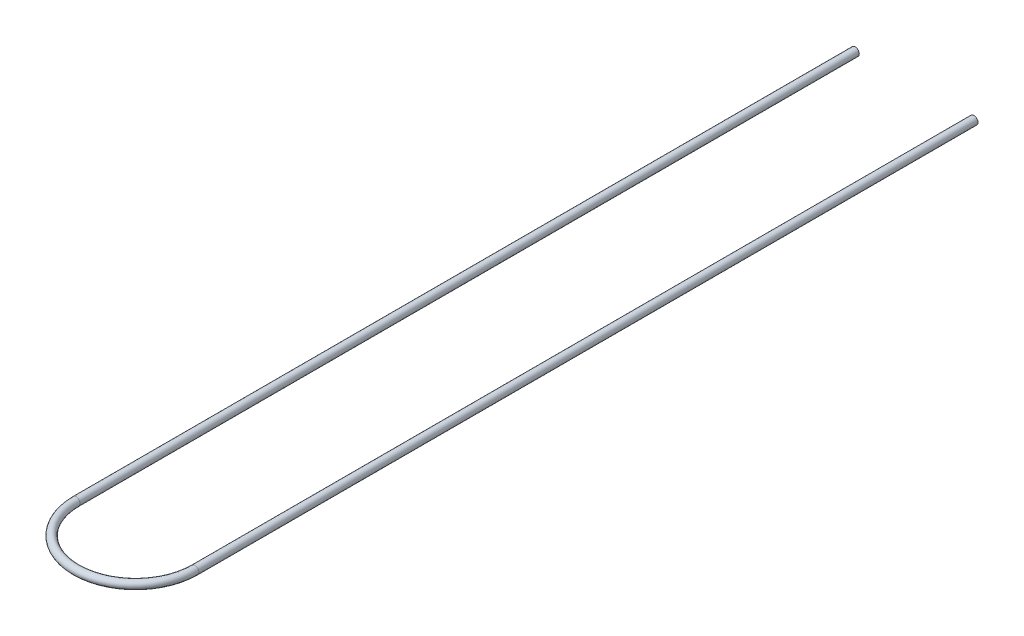
ISO-10303-21;
HEADER;
FILE_DESCRIPTION(('STEP AP214'),'2;1');
FILE_NAME('part.step','',(''),(''),'','','');
FILE_SCHEMA(('AUTOMOTIVE_DESIGN { 1 0 10303 214 1 1 1 1 }'));
ENDSEC;
DATA;
#1=APPLICATION_CONTEXT('core data for automotive mechanical design processes');
#2=APPLICATION_PROTOCOL_DEFINITION('international standard','automotive_design',2000,#1);
#3=PRODUCT_CONTEXT('',#1,'mechanical');
#4=PRODUCT('Part','Part','',(#3));
#5=PRODUCT_RELATED_PRODUCT_CATEGORY('part','',(#4));
#6=PRODUCT_DEFINITION_FORMATION('','',#4);
#7=PRODUCT_DEFINITION_CONTEXT('part definition',#1,'design');
#8=PRODUCT_DEFINITION('design','',#6,#7);
#9=PRODUCT_DEFINITION_SHAPE('','',#8);
#10=(LENGTH_UNIT() NAMED_UNIT(*) SI_UNIT(.MILLI.,.METRE.));
#11=(NAMED_UNIT(*) PLANE_ANGLE_UNIT() SI_UNIT($,.RADIAN.));
#12=(NAMED_UNIT(*) SI_UNIT($,.STERADIAN.) SOLID_ANGLE_UNIT());
#13=UNCERTAINTY_MEASURE_WITH_UNIT(LENGTH_MEASURE(1.E-05),#10,'distance_accuracy_value','');
#14=(GEOMETRIC_REPRESENTATION_CONTEXT(3) GLOBAL_UNCERTAINTY_ASSIGNED_CONTEXT((#13)) GLOBAL_UNIT_ASSIGNED_CONTEXT((#10,
#11,#12)) REPRESENTATION_CONTEXT('',''));
#15=CARTESIAN_POINT('',(0.,0.,0.));
#16=DIRECTION('',(0.,0.,1.));
#17=DIRECTION('',(1.,0.,0.));
#18=AXIS2_PLACEMENT_3D('',#15,#16,#17);
#19=CARTESIAN_POINT('',(-40.,0.,299.999999999999));
#20=DIRECTION('',(0.,0.,1.));
#21=DIRECTION('',(1.,0.,0.));
#22=AXIS2_PLACEMENT_3D('',#19,#20,#21);
#23=CYLINDRICAL_SURFACE('',#22,11.1);
#24=CARTESIAN_POINT('',(-39.9999999999997,0.,2440.));
#25=DIRECTION('',(0.,0.,1.));
#26=DIRECTION('',(1.,0.,0.));
#27=AXIS2_PLACEMENT_3D('',#24,#25,#26);
#28=CIRCLE('',#27,11.1);
#29=CARTESIAN_POINT('',(-51.0999999999997,0.,2440.));
#30=VERTEX_POINT('',#29);
#31=EDGE_CURVE('E52',#30,#30,#28,.T.);
#32=ORIENTED_EDGE('',*,*,#31,.F.);
#33=EDGE_LOOP('',(#32));
#34=FACE_BOUND('',#33,.T.);
#35=CARTESIAN_POINT('',(-40.,0.,299.999999999999));
#36=DIRECTION('',(0.,0.,1.));
#37=DIRECTION('',(1.,0.,0.));
#38=AXIS2_PLACEMENT_3D('',#35,#36,#37);
#39=CIRCLE('',#38,11.1);
#40=CARTESIAN_POINT('',(-28.9,0.,299.999999999999));
#41=VERTEX_POINT('',#40);
#42=EDGE_CURVE('E50',#41,#41,#39,.T.);
#43=ORIENTED_EDGE('',*,*,#42,.T.);
#44=EDGE_LOOP('',(#43));
#45=FACE_BOUND('',#44,.T.);
#46=ADVANCED_FACE('F29',(#34,#45),#23,.T.);
#47=CARTESIAN_POINT('',(123.08,0.,2440.));
#48=DIRECTION('',(0.,1.,0.));
#49=DIRECTION('',(0.,0.,1.));
#50=AXIS2_PLACEMENT_3D('',#47,#48,#49);
#51=TOROIDAL_SURFACE('',#50,163.08,11.1);
#52=CARTESIAN_POINT('',(286.16,0.,2440.));
#53=DIRECTION('',(0.,0.,-1.));
#54=DIRECTION('',(-1.,0.,0.));
#55=AXIS2_PLACEMENT_3D('',#52,#53,#54);
#56=CIRCLE('',#55,11.1);
#57=CARTESIAN_POINT('',(297.26,0.,2440.));
#58=VERTEX_POINT('',#57);
#59=EDGE_CURVE('E33',#58,#58,#56,.T.);
#60=CARTESIAN_POINT('',(123.08,0.,2440.));
#61=DIRECTION('',(0.,1.,0.));
#62=DIRECTION('',(0.,0.,1.));
#63=AXIS2_PLACEMENT_3D('',#60,#61,#62);
#64=CIRCLE('',#63,174.18);
#65=EDGE_CURVE('',#30,#58,#64,.T.);
#66=ORIENTED_EDGE('',*,*,#31,.T.);
#67=ORIENTED_EDGE('',*,*,#59,.F.);
#68=ORIENTED_EDGE('',*,*,#65,.T.);
#69=ORIENTED_EDGE('',*,*,#65,.F.);
#70=EDGE_LOOP('',(#66,#68,#67,#69));
#71=FACE_BOUND('',#70,.T.);
#72=ADVANCED_FACE('F60',(#71),#51,.T.);
#73=CARTESIAN_POINT('',(286.16,0.,2440.));
#74=DIRECTION('',(0.,0.,-1.));
#75=DIRECTION('',(-1.,0.,0.));
#76=AXIS2_PLACEMENT_3D('',#73,#74,#75);
#77=CYLINDRICAL_SURFACE('',#76,11.1);
#78=CARTESIAN_POINT('',(286.16,0.,299.999999999999));
#79=DIRECTION('',(0.,0.,-1.));
#80=DIRECTION('',(-1.,0.,0.));
#81=AXIS2_PLACEMENT_3D('',#78,#79,#80);
#82=CIRCLE('',#81,11.1);
#83=CARTESIAN_POINT('',(275.06,0.,299.999999999999));
#84=VERTEX_POINT('',#83);
#85=EDGE_CURVE('E46',#84,#84,#82,.T.);
#86=ORIENTED_EDGE('',*,*,#85,.F.);
#87=EDGE_LOOP('',(#86));
#88=FACE_BOUND('',#87,.T.);
#89=ORIENTED_EDGE('',*,*,#59,.T.);
#90=EDGE_LOOP('',(#89));
#91=FACE_BOUND('',#90,.T.);
#92=ADVANCED_FACE('F31',(#88,#91),#77,.T.);
#93=CARTESIAN_POINT('',(-40.,0.,299.999999999999));
#94=DIRECTION('',(0.,0.,1.));
#95=DIRECTION('',(1.,0.,0.));
#96=AXIS2_PLACEMENT_3D('',#93,#94,#95);
#97=PLANE('',#96);
#98=CARTESIAN_POINT('',(-40.,0.,299.999999999999));
#99=DIRECTION('',(0.,0.,1.));
#100=DIRECTION('',(1.,0.,0.));
#101=AXIS2_PLACEMENT_3D('',#98,#99,#100);
#102=CIRCLE('',#101,9.95000000000001);
#103=CARTESIAN_POINT('',(-30.05,0.,299.999999999999));
#104=VERTEX_POINT('',#103);
#105=EDGE_CURVE('E49',#104,#104,#102,.F.);
#106=ORIENTED_EDGE('',*,*,#105,.F.);
#107=EDGE_LOOP('',(#106));
#108=FACE_BOUND('',#107,.T.);
#109=ORIENTED_EDGE('',*,*,#42,.F.);
#110=EDGE_LOOP('',(#109));
#111=FACE_BOUND('',#110,.T.);
#112=ADVANCED_FACE('F66',(#108,#111),#97,.F.);
#113=CARTESIAN_POINT('',(286.16,0.,299.999999999999));
#114=DIRECTION('',(0.,0.,-1.));
#115=DIRECTION('',(-1.,0.,0.));
#116=AXIS2_PLACEMENT_3D('',#113,#114,#115);
#117=PLANE('',#116);
#118=CARTESIAN_POINT('',(286.16,0.,299.999999999999));
#119=DIRECTION('',(0.,0.,-1.));
#120=DIRECTION('',(-1.,0.,0.));
#121=AXIS2_PLACEMENT_3D('',#118,#119,#120);
#122=CIRCLE('',#121,9.95000000000001);
#123=CARTESIAN_POINT('',(276.21,0.,299.999999999999));
#124=VERTEX_POINT('',#123);
#125=EDGE_CURVE('E10',#124,#124,#122,.F.);
#126=ORIENTED_EDGE('',*,*,#125,.T.);
#127=EDGE_LOOP('',(#126));
#128=FACE_BOUND('',#127,.T.);
#129=ORIENTED_EDGE('',*,*,#85,.T.);
#130=EDGE_LOOP('',(#129));
#131=FACE_BOUND('',#130,.T.);
#132=ADVANCED_FACE('F84',(#128,#131),#117,.T.);
#133=CARTESIAN_POINT('',(-40.,0.,299.999999999999));
#134=DIRECTION('',(0.,0.,1.));
#135=DIRECTION('',(1.,0.,0.));
#136=AXIS2_PLACEMENT_3D('',#133,#134,#135);
#137=CYLINDRICAL_SURFACE('',#136,9.95000000000001);
#138=CARTESIAN_POINT('',(-39.9999999999997,0.,2440.));
#139=DIRECTION('',(0.,0.,1.));
#140=DIRECTION('',(1.,0.,0.));
#141=AXIS2_PLACEMENT_3D('',#138,#139,#140);
#142=CIRCLE('',#141,9.95000000000001);
#143=CARTESIAN_POINT('',(-49.9499999999997,0.,2440.));
#144=VERTEX_POINT('',#143);
#145=EDGE_CURVE('E42',#144,#144,#142,.F.);
#146=ORIENTED_EDGE('',*,*,#145,.F.);
#147=EDGE_LOOP('',(#146));
#148=FACE_BOUND('',#147,.T.);
#149=ORIENTED_EDGE('',*,*,#105,.T.);
#150=EDGE_LOOP('',(#149));
#151=FACE_BOUND('',#150,.T.);
#152=ADVANCED_FACE('F78',(#148,#151),#137,.F.);
#153=CARTESIAN_POINT('',(123.08,0.,2440.));
#154=DIRECTION('',(0.,1.,0.));
#155=DIRECTION('',(0.,0.,1.));
#156=AXIS2_PLACEMENT_3D('',#153,#154,#155);
#157=TOROIDAL_SURFACE('',#156,163.08,9.95000000000001);
#158=CARTESIAN_POINT('',(286.16,0.,2440.));
#159=DIRECTION('',(0.,0.,-1.));
#160=DIRECTION('',(-1.,0.,0.));
#161=AXIS2_PLACEMENT_3D('',#158,#159,#160);
#162=CIRCLE('',#161,9.95000000000001);
#163=CARTESIAN_POINT('',(296.11,0.,2440.));
#164=VERTEX_POINT('',#163);
#165=EDGE_CURVE('E37',#164,#164,#162,.F.);
#166=CARTESIAN_POINT('',(123.08,0.,2440.));
#167=DIRECTION('',(0.,1.,0.));
#168=DIRECTION('',(0.,0.,1.));
#169=AXIS2_PLACEMENT_3D('',#166,#167,#168);
#170=CIRCLE('',#169,173.03);
#171=EDGE_CURVE('',#144,#164,#170,.T.);
#172=ORIENTED_EDGE('',*,*,#145,.T.);
#173=ORIENTED_EDGE('',*,*,#165,.F.);
#174=ORIENTED_EDGE('',*,*,#171,.T.);
#175=ORIENTED_EDGE('',*,*,#171,.F.);
#176=EDGE_LOOP('',(#172,#174,#173,#175));
#177=FACE_BOUND('',#176,.T.);
#178=ADVANCED_FACE('F72',(#177),#157,.F.);
#179=CARTESIAN_POINT('',(286.16,0.,2440.));
#180=DIRECTION('',(0.,0.,-1.));
#181=DIRECTION('',(-1.,0.,0.));
#182=AXIS2_PLACEMENT_3D('',#179,#180,#181);
#183=CYLINDRICAL_SURFACE('',#182,9.95000000000001);
#184=ORIENTED_EDGE('',*,*,#125,.F.);
#185=EDGE_LOOP('',(#184));
#186=FACE_BOUND('',#185,.T.);
#187=ORIENTED_EDGE('',*,*,#165,.T.);
#188=EDGE_LOOP('',(#187));
#189=FACE_BOUND('',#188,.T.);
#190=ADVANCED_FACE('F70',(#186,#189),#183,.F.);
#191=CLOSED_SHELL('',(#46,#72,#92,#112,#132,#152,#178,#190));
#192=MANIFOLD_SOLID_BREP('B2',#191);
#193=ADVANCED_BREP_SHAPE_REPRESENTATION('',(#18,#192),#14);
#194=SHAPE_DEFINITION_REPRESENTATION(#9,#193);
ENDSEC;
END-ISO-10303-21;
